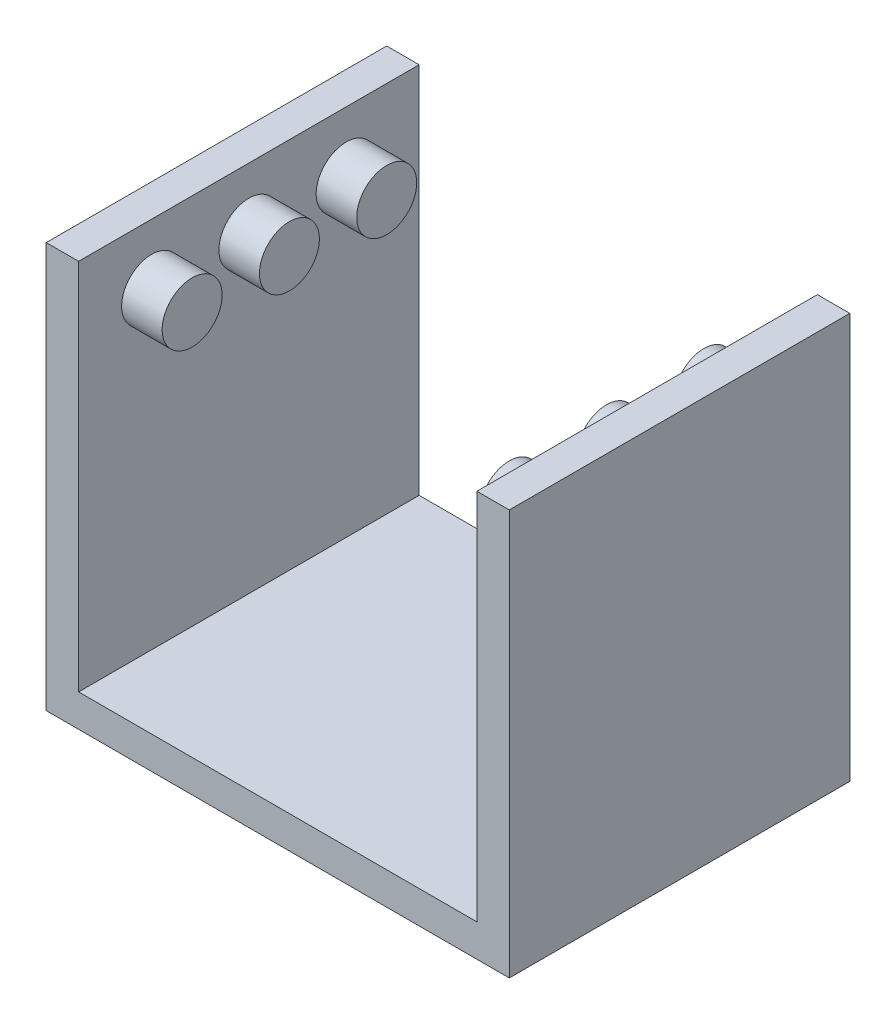
ISO-10303-21;
HEADER;
FILE_DESCRIPTION(('STEP AP214'),'2;1');
FILE_NAME('part.step','',(''),(''),'','','');
FILE_SCHEMA(('AUTOMOTIVE_DESIGN { 1 0 10303 214 1 1 1 1 }'));
ENDSEC;
DATA;
#1=APPLICATION_CONTEXT('core data for automotive mechanical design processes');
#2=APPLICATION_PROTOCOL_DEFINITION('international standard','automotive_design',2000,#1);
#3=PRODUCT_CONTEXT('',#1,'mechanical');
#4=PRODUCT('Part','Part','',(#3));
#5=PRODUCT_RELATED_PRODUCT_CATEGORY('part','',(#4));
#6=PRODUCT_DEFINITION_FORMATION('','',#4);
#7=PRODUCT_DEFINITION_CONTEXT('part definition',#1,'design');
#8=PRODUCT_DEFINITION('design','',#6,#7);
#9=PRODUCT_DEFINITION_SHAPE('','',#8);
#10=(LENGTH_UNIT() NAMED_UNIT(*) SI_UNIT(.MILLI.,.METRE.));
#11=(NAMED_UNIT(*) PLANE_ANGLE_UNIT() SI_UNIT($,.RADIAN.));
#12=(NAMED_UNIT(*) SI_UNIT($,.STERADIAN.) SOLID_ANGLE_UNIT());
#13=UNCERTAINTY_MEASURE_WITH_UNIT(LENGTH_MEASURE(1.E-05),#10,'distance_accuracy_value','');
#14=(GEOMETRIC_REPRESENTATION_CONTEXT(3) GLOBAL_UNCERTAINTY_ASSIGNED_CONTEXT((#13)) GLOBAL_UNIT_ASSIGNED_CONTEXT((#10,
#11,#12)) REPRESENTATION_CONTEXT('',''));
#15=CARTESIAN_POINT('',(0.,0.,0.));
#16=DIRECTION('',(0.,0.,1.));
#17=DIRECTION('',(1.,0.,0.));
#18=AXIS2_PLACEMENT_3D('',#15,#16,#17);
#19=CARTESIAN_POINT('',(-9.73952411496912,-24.,-4.5));
#20=DIRECTION('',(-1.,0.,0.));
#21=DIRECTION('',(0.,0.,1.));
#22=AXIS2_PLACEMENT_3D('',#19,#20,#21);
#23=CYLINDRICAL_SURFACE('',#22,1.85);
#24=CARTESIAN_POINT('',(-9.73952411496912,-24.,-4.5));
#25=DIRECTION('',(1.,0.,0.));
#26=DIRECTION('',(0.,0.,-1.));
#27=AXIS2_PLACEMENT_3D('',#24,#25,#26);
#28=CIRCLE('',#27,1.85);
#29=CARTESIAN_POINT('',(-9.73952411496912,-24.,-6.35));
#30=VERTEX_POINT('',#29);
#31=EDGE_CURVE('E49',#30,#30,#28,.T.);
#32=ORIENTED_EDGE('',*,*,#31,.F.);
#33=EDGE_LOOP('',(#32));
#34=FACE_BOUND('',#33,.T.);
#35=CARTESIAN_POINT('',(-12.2395241149691,-24.,-4.5));
#36=DIRECTION('',(1.,0.,0.));
#37=DIRECTION('',(0.,0.,-1.));
#38=AXIS2_PLACEMENT_3D('',#35,#36,#37);
#39=CIRCLE('',#38,1.85);
#40=CARTESIAN_POINT('',(-12.2395241149691,-24.,-6.35));
#41=VERTEX_POINT('',#40);
#42=EDGE_CURVE('E11',#41,#41,#39,.T.);
#43=ORIENTED_EDGE('',*,*,#42,.T.);
#44=EDGE_LOOP('',(#43));
#45=FACE_BOUND('',#44,.T.);
#46=ADVANCED_FACE('F45',(#34,#45),#23,.T.);
#47=CARTESIAN_POINT('',(-9.73952411496912,-24.,-4.5));
#48=DIRECTION('',(1.,0.,0.));
#49=DIRECTION('',(0.,0.,-1.));
#50=AXIS2_PLACEMENT_3D('',#47,#48,#49);
#51=PLANE('',#50);
#52=ORIENTED_EDGE('',*,*,#31,.T.);
#53=EDGE_LOOP('',(#52));
#54=FACE_BOUND('',#53,.T.);
#55=ADVANCED_FACE('F47',(#54),#51,.T.);
#56=CARTESIAN_POINT('',(-12.2395241149691,-24.,-4.5));
#57=DIRECTION('',(1.,0.,0.));
#58=DIRECTION('',(0.,0.,-1.));
#59=AXIS2_PLACEMENT_3D('',#56,#57,#58);
#60=PLANE('',#59);
#61=ORIENTED_EDGE('',*,*,#42,.F.);
#62=EDGE_LOOP('',(#61));
#63=FACE_BOUND('',#62,.T.);
#64=ADVANCED_FACE('F64',(#63),#60,.F.);
#65=CLOSED_SHELL('',(#46,#55,#64));
#66=MANIFOLD_SOLID_BREP('B2',#65);
#67=CARTESIAN_POINT('',(-9.73952411496912,-24.,-10.5));
#68=DIRECTION('',(-1.,0.,0.));
#69=DIRECTION('',(0.,0.,1.));
#70=AXIS2_PLACEMENT_3D('',#67,#68,#69);
#71=CYLINDRICAL_SURFACE('',#70,1.85);
#72=CARTESIAN_POINT('',(-9.73952411496912,-24.,-10.5));
#73=DIRECTION('',(1.,0.,0.));
#74=DIRECTION('',(0.,0.,-1.));
#75=AXIS2_PLACEMENT_3D('',#72,#73,#74);
#76=CIRCLE('',#75,1.85);
#77=CARTESIAN_POINT('',(-9.73952411496912,-24.,-12.35));
#78=VERTEX_POINT('',#77);
#79=EDGE_CURVE('E103',#78,#78,#76,.T.);
#80=ORIENTED_EDGE('',*,*,#79,.F.);
#81=EDGE_LOOP('',(#80));
#82=FACE_BOUND('',#81,.T.);
#83=CARTESIAN_POINT('',(-12.2395241149691,-24.,-10.5));
#84=DIRECTION('',(1.,0.,0.));
#85=DIRECTION('',(0.,0.,-1.));
#86=AXIS2_PLACEMENT_3D('',#83,#84,#85);
#87=CIRCLE('',#86,1.85);
#88=CARTESIAN_POINT('',(-12.2395241149691,-24.,-12.35));
#89=VERTEX_POINT('',#88);
#90=EDGE_CURVE('E44',#89,#89,#87,.T.);
#91=ORIENTED_EDGE('',*,*,#90,.T.);
#92=EDGE_LOOP('',(#91));
#93=FACE_BOUND('',#92,.T.);
#94=ADVANCED_FACE('F99',(#82,#93),#71,.T.);
#95=CARTESIAN_POINT('',(-9.73952411496912,-24.,-10.5));
#96=DIRECTION('',(1.,0.,0.));
#97=DIRECTION('',(0.,0.,-1.));
#98=AXIS2_PLACEMENT_3D('',#95,#96,#97);
#99=PLANE('',#98);
#100=ORIENTED_EDGE('',*,*,#79,.T.);
#101=EDGE_LOOP('',(#100));
#102=FACE_BOUND('',#101,.T.);
#103=ADVANCED_FACE('F101',(#102),#99,.T.);
#104=CARTESIAN_POINT('',(-12.2395241149691,-24.,-10.5));
#105=DIRECTION('',(1.,0.,0.));
#106=DIRECTION('',(0.,0.,-1.));
#107=AXIS2_PLACEMENT_3D('',#104,#105,#106);
#108=PLANE('',#107);
#109=ORIENTED_EDGE('',*,*,#90,.F.);
#110=EDGE_LOOP('',(#109));
#111=FACE_BOUND('',#110,.T.);
#112=ADVANCED_FACE('F118',(#111),#108,.F.);
#113=CLOSED_SHELL('',(#94,#103,#112));
#114=MANIFOLD_SOLID_BREP('B6',#113);
#115=CARTESIAN_POINT('',(-9.73952411496912,-24.,-16.5));
#116=DIRECTION('',(-1.,0.,0.));
#117=DIRECTION('',(0.,0.,1.));
#118=AXIS2_PLACEMENT_3D('',#115,#116,#117);
#119=CYLINDRICAL_SURFACE('',#118,1.85);
#120=CARTESIAN_POINT('',(-9.73952411496912,-24.,-16.5));
#121=DIRECTION('',(1.,0.,0.));
#122=DIRECTION('',(0.,0.,-1.));
#123=AXIS2_PLACEMENT_3D('',#120,#121,#122);
#124=CIRCLE('',#123,1.85);
#125=CARTESIAN_POINT('',(-9.73952411496912,-24.,-18.35));
#126=VERTEX_POINT('',#125);
#127=EDGE_CURVE('E98',#126,#126,#124,.T.);
#128=ORIENTED_EDGE('',*,*,#127,.F.);
#129=EDGE_LOOP('',(#128));
#130=FACE_BOUND('',#129,.T.);
#131=CARTESIAN_POINT('',(-12.2395241149691,-24.,-16.5));
#132=DIRECTION('',(1.,0.,0.));
#133=DIRECTION('',(0.,0.,-1.));
#134=AXIS2_PLACEMENT_3D('',#131,#132,#133);
#135=CIRCLE('',#134,1.85);
#136=CARTESIAN_POINT('',(-12.2395241149691,-24.,-18.35));
#137=VERTEX_POINT('',#136);
#138=EDGE_CURVE('E157',#137,#137,#135,.T.);
#139=ORIENTED_EDGE('',*,*,#138,.T.);
#140=EDGE_LOOP('',(#139));
#141=FACE_BOUND('',#140,.T.);
#142=ADVANCED_FACE('F154',(#130,#141),#119,.T.);
#143=CARTESIAN_POINT('',(-9.73952411496912,-24.,-16.5));
#144=DIRECTION('',(1.,0.,0.));
#145=DIRECTION('',(0.,0.,-1.));
#146=AXIS2_PLACEMENT_3D('',#143,#144,#145);
#147=PLANE('',#146);
#148=ORIENTED_EDGE('',*,*,#127,.T.);
#149=EDGE_LOOP('',(#148));
#150=FACE_BOUND('',#149,.T.);
#151=ADVANCED_FACE('F169',(#150),#147,.T.);
#152=CARTESIAN_POINT('',(-12.2395241149691,-24.,-16.5));
#153=DIRECTION('',(1.,0.,0.));
#154=DIRECTION('',(0.,0.,-1.));
#155=AXIS2_PLACEMENT_3D('',#152,#153,#154);
#156=PLANE('',#155);
#157=ORIENTED_EDGE('',*,*,#138,.F.);
#158=EDGE_LOOP('',(#157));
#159=FACE_BOUND('',#158,.T.);
#160=ADVANCED_FACE('F167',(#159),#156,.F.);
#161=CLOSED_SHELL('',(#142,#151,#160));
#162=MANIFOLD_SOLID_BREP('B39',#161);
#163=CARTESIAN_POINT('',(12.3206969324508,-43.2719705138247,-21.));
#164=DIRECTION('',(0.,1.,0.));
#165=DIRECTION('',(0.,0.,1.));
#166=AXIS2_PLACEMENT_3D('',#163,#164,#165);
#167=PLANE('',#166);
#168=DIRECTION('',(-1.,0.,0.));
#169=VECTOR('',#168,1.);
#170=CARTESIAN_POINT('',(12.3206969324508,-43.2719705138247,0.));
#171=LINE('',#170,#169);
#172=CARTESIAN_POINT('',(12.3206969324508,-43.2719705138247,0.));
#173=VERTEX_POINT('',#172);
#174=CARTESIAN_POINT('',(-12.2395241149691,-43.2719705138247,0.));
#175=VERTEX_POINT('',#174);
#176=EDGE_CURVE('E298',#173,#175,#171,.T.);
#177=ORIENTED_EDGE('',*,*,#176,.F.);
#178=DIRECTION('',(0.,0.,1.));
#179=VECTOR('',#178,1.);
#180=CARTESIAN_POINT('',(12.3206969324508,-43.2719705138247,-21.));
#181=LINE('',#180,#179);
#182=CARTESIAN_POINT('',(12.3206969324508,-43.2719705138247,-21.));
#183=VERTEX_POINT('',#182);
#184=EDGE_CURVE('E152',#183,#173,#181,.T.);
#185=ORIENTED_EDGE('',*,*,#184,.F.);
#186=DIRECTION('',(-1.,0.,0.));
#187=VECTOR('',#186,1.);
#188=CARTESIAN_POINT('',(12.3206969324508,-43.2719705138247,-21.));
#189=LINE('',#188,#187);
#190=CARTESIAN_POINT('',(-12.2395241149691,-43.2719705138247,-21.));
#191=VERTEX_POINT('',#190);
#192=EDGE_CURVE('E319',#183,#191,#189,.T.);
#193=ORIENTED_EDGE('',*,*,#192,.T.);
#194=DIRECTION('',(0.,0.,1.));
#195=VECTOR('',#194,1.);
#196=CARTESIAN_POINT('',(-12.2395241149691,-43.2719705138247,-21.));
#197=LINE('',#196,#195);
#198=EDGE_CURVE('E204',#191,#175,#197,.T.);
#199=ORIENTED_EDGE('',*,*,#198,.T.);
#200=EDGE_LOOP('',(#177,#185,#193,#199));
#201=FACE_BOUND('',#200,.T.);
#202=ADVANCED_FACE('F201',(#201),#167,.T.);
#203=CARTESIAN_POINT('',(12.3206969324508,-20.2719705138247,-21.));
#204=DIRECTION('',(-1.,0.,0.));
#205=DIRECTION('',(0.,-1.,0.));
#206=AXIS2_PLACEMENT_3D('',#203,#204,#205);
#207=PLANE('',#206);
#208=CARTESIAN_POINT('',(12.3206969324508,-24.,-16.5));
#209=DIRECTION('',(-1.,0.,0.));
#210=DIRECTION('',(0.,-1.,0.));
#211=AXIS2_PLACEMENT_3D('',#208,#209,#210);
#212=CIRCLE('',#211,1.85);
#213=CARTESIAN_POINT('',(12.3206969324508,-25.85,-16.5));
#214=VERTEX_POINT('',#213);
#215=EDGE_CURVE('E396',#214,#214,#212,.T.);
#216=ORIENTED_EDGE('',*,*,#215,.F.);
#217=EDGE_LOOP('',(#216));
#218=FACE_BOUND('',#217,.T.);
#219=CARTESIAN_POINT('',(12.3206969324508,-24.,-10.5));
#220=DIRECTION('',(-1.,0.,0.));
#221=DIRECTION('',(0.,-1.,0.));
#222=AXIS2_PLACEMENT_3D('',#219,#220,#221);
#223=CIRCLE('',#222,1.85);
#224=CARTESIAN_POINT('',(12.3206969324508,-25.85,-10.5));
#225=VERTEX_POINT('',#224);
#226=EDGE_CURVE('E400',#225,#225,#223,.T.);
#227=ORIENTED_EDGE('',*,*,#226,.F.);
#228=EDGE_LOOP('',(#227));
#229=FACE_BOUND('',#228,.T.);
#230=CARTESIAN_POINT('',(12.3206969324508,-24.,-4.5));
#231=DIRECTION('',(-1.,0.,0.));
#232=DIRECTION('',(0.,-1.,0.));
#233=AXIS2_PLACEMENT_3D('',#230,#231,#232);
#234=CIRCLE('',#233,1.85);
#235=CARTESIAN_POINT('',(12.3206969324508,-25.85,-4.5));
#236=VERTEX_POINT('',#235);
#237=EDGE_CURVE('E405',#236,#236,#234,.T.);
#238=ORIENTED_EDGE('',*,*,#237,.F.);
#239=EDGE_LOOP('',(#238));
#240=FACE_BOUND('',#239,.T.);
#241=DIRECTION('',(0.,-1.,0.));
#242=VECTOR('',#241,1.);
#243=CARTESIAN_POINT('',(12.3206969324508,-20.2719705138247,0.));
#244=LINE('',#243,#242);
#245=CARTESIAN_POINT('',(12.3206969324508,-20.2719705138247,0.));
#246=VERTEX_POINT('',#245);
#247=EDGE_CURVE('E317',#246,#173,#244,.T.);
#248=ORIENTED_EDGE('',*,*,#247,.F.);
#249=DIRECTION('',(0.,0.,1.));
#250=VECTOR('',#249,1.);
#251=CARTESIAN_POINT('',(12.3206969324508,-20.2719705138247,-21.));
#252=LINE('',#251,#250);
#253=CARTESIAN_POINT('',(12.3206969324508,-20.2719705138247,-21.));
#254=VERTEX_POINT('',#253);
#255=EDGE_CURVE('E210',#254,#246,#252,.T.);
#256=ORIENTED_EDGE('',*,*,#255,.F.);
#257=DIRECTION('',(0.,-1.,0.));
#258=VECTOR('',#257,1.);
#259=CARTESIAN_POINT('',(12.3206969324508,-20.2719705138247,-21.));
#260=LINE('',#259,#258);
#261=EDGE_CURVE('E288',#254,#183,#260,.T.);
#262=ORIENTED_EDGE('',*,*,#261,.T.);
#263=ORIENTED_EDGE('',*,*,#184,.T.);
#264=EDGE_LOOP('',(#248,#256,#262,#263));
#265=FACE_BOUND('',#264,.T.);
#266=ADVANCED_FACE('F331',(#218,#229,#240,#265),#207,.T.);
#267=CARTESIAN_POINT('',(12.3206969324508,-20.2719705138247,-21.));
#268=DIRECTION('',(0.,1.,0.));
#269=DIRECTION('',(0.,0.,1.));
#270=AXIS2_PLACEMENT_3D('',#267,#268,#269);
#271=PLANE('',#270);
#272=DIRECTION('',(-1.,0.,0.));
#273=VECTOR('',#272,1.);
#274=CARTESIAN_POINT('',(12.3206969324508,-20.2719705138247,0.));
#275=LINE('',#274,#273);
#276=CARTESIAN_POINT('',(14.3206969324508,-20.2719705138247,0.));
#277=VERTEX_POINT('',#276);
#278=EDGE_CURVE('E275',#277,#246,#275,.T.);
#279=ORIENTED_EDGE('',*,*,#278,.F.);
#280=DIRECTION('',(0.,0.,1.));
#281=VECTOR('',#280,1.);
#282=CARTESIAN_POINT('',(14.3206969324508,-20.2719705138247,-21.));
#283=LINE('',#282,#281);
#284=CARTESIAN_POINT('',(14.3206969324508,-20.2719705138247,-21.));
#285=VERTEX_POINT('',#284);
#286=EDGE_CURVE('E270',#285,#277,#283,.T.);
#287=ORIENTED_EDGE('',*,*,#286,.F.);
#288=DIRECTION('',(-1.,0.,0.));
#289=VECTOR('',#288,1.);
#290=CARTESIAN_POINT('',(12.3206969324508,-20.2719705138247,-21.));
#291=LINE('',#290,#289);
#292=EDGE_CURVE('E273',#285,#254,#291,.T.);
#293=ORIENTED_EDGE('',*,*,#292,.T.);
#294=ORIENTED_EDGE('',*,*,#255,.T.);
#295=EDGE_LOOP('',(#279,#287,#293,#294));
#296=FACE_BOUND('',#295,.T.);
#297=ADVANCED_FACE('F272',(#296),#271,.T.);
#298=CARTESIAN_POINT('',(14.3206969324508,-20.2719705138247,-21.));
#299=DIRECTION('',(1.,0.,0.));
#300=DIRECTION('',(0.,1.,0.));
#301=AXIS2_PLACEMENT_3D('',#298,#299,#300);
#302=PLANE('',#301);
#303=DIRECTION('',(0.,1.,0.));
#304=VECTOR('',#303,1.);
#305=CARTESIAN_POINT('',(14.3206969324508,-20.2719705138247,0.));
#306=LINE('',#305,#304);
#307=CARTESIAN_POINT('',(14.3206969324508,-45.2719705138247,0.));
#308=VERTEX_POINT('',#307);
#309=EDGE_CURVE('E314',#308,#277,#306,.T.);
#310=ORIENTED_EDGE('',*,*,#309,.F.);
#311=DIRECTION('',(0.,0.,1.));
#312=VECTOR('',#311,1.);
#313=CARTESIAN_POINT('',(14.3206969324508,-45.2719705138247,-21.));
#314=LINE('',#313,#312);
#315=CARTESIAN_POINT('',(14.3206969324508,-45.2719705138247,-21.));
#316=VERTEX_POINT('',#315);
#317=EDGE_CURVE('E280',#316,#308,#314,.T.);
#318=ORIENTED_EDGE('',*,*,#317,.F.);
#319=DIRECTION('',(0.,1.,0.));
#320=VECTOR('',#319,1.);
#321=CARTESIAN_POINT('',(14.3206969324508,-20.2719705138247,-21.));
#322=LINE('',#321,#320);
#323=EDGE_CURVE('E286',#316,#285,#322,.T.);
#324=ORIENTED_EDGE('',*,*,#323,.T.);
#325=ORIENTED_EDGE('',*,*,#286,.T.);
#326=EDGE_LOOP('',(#310,#318,#324,#325));
#327=FACE_BOUND('',#326,.T.);
#328=ADVANCED_FACE('F290',(#327),#302,.T.);
#329=CARTESIAN_POINT('',(14.3206969324508,-45.2719705138247,-21.));
#330=DIRECTION('',(0.,-1.,0.));
#331=DIRECTION('',(0.,0.,-1.));
#332=AXIS2_PLACEMENT_3D('',#329,#330,#331);
#333=PLANE('',#332);
#334=DIRECTION('',(1.,0.,0.));
#335=VECTOR('',#334,1.);
#336=CARTESIAN_POINT('',(14.3206969324508,-45.2719705138247,0.));
#337=LINE('',#336,#335);
#338=CARTESIAN_POINT('',(-14.2395241149691,-45.2719705138247,0.));
#339=VERTEX_POINT('',#338);
#340=EDGE_CURVE('E311',#339,#308,#337,.T.);
#341=ORIENTED_EDGE('',*,*,#340,.F.);
#342=DIRECTION('',(0.,0.,1.));
#343=VECTOR('',#342,1.);
#344=CARTESIAN_POINT('',(-14.2395241149691,-45.2719705138247,-21.));
#345=LINE('',#344,#343);
#346=CARTESIAN_POINT('',(-14.2395241149691,-45.2719705138247,-21.));
#347=VERTEX_POINT('',#346);
#348=EDGE_CURVE('E323',#347,#339,#345,.T.);
#349=ORIENTED_EDGE('',*,*,#348,.F.);
#350=DIRECTION('',(1.,0.,0.));
#351=VECTOR('',#350,1.);
#352=CARTESIAN_POINT('',(14.3206969324508,-45.2719705138247,-21.));
#353=LINE('',#352,#351);
#354=EDGE_CURVE('E291',#347,#316,#353,.T.);
#355=ORIENTED_EDGE('',*,*,#354,.T.);
#356=ORIENTED_EDGE('',*,*,#317,.T.);
#357=EDGE_LOOP('',(#341,#349,#355,#356));
#358=FACE_BOUND('',#357,.T.);
#359=ADVANCED_FACE('F347',(#358),#333,.T.);
#360=CARTESIAN_POINT('',(-14.2395241149691,-45.2719705138247,-21.));
#361=DIRECTION('',(-1.,0.,0.));
#362=DIRECTION('',(0.,-1.,0.));
#363=AXIS2_PLACEMENT_3D('',#360,#361,#362);
#364=PLANE('',#363);
#365=DIRECTION('',(0.,-1.,0.));
#366=VECTOR('',#365,1.);
#367=CARTESIAN_POINT('',(-14.2395241149691,-45.2719705138247,0.));
#368=LINE('',#367,#366);
#369=CARTESIAN_POINT('',(-14.2395241149691,-20.2719705138247,0.));
#370=VERTEX_POINT('',#369);
#371=EDGE_CURVE('E308',#370,#339,#368,.T.);
#372=ORIENTED_EDGE('',*,*,#371,.F.);
#373=DIRECTION('',(0.,0.,1.));
#374=VECTOR('',#373,1.);
#375=CARTESIAN_POINT('',(-14.2395241149691,-20.2719705138247,-21.));
#376=LINE('',#375,#374);
#377=CARTESIAN_POINT('',(-14.2395241149691,-20.2719705138247,-21.));
#378=VERTEX_POINT('',#377);
#379=EDGE_CURVE('E325',#378,#370,#376,.T.);
#380=ORIENTED_EDGE('',*,*,#379,.F.);
#381=DIRECTION('',(0.,-1.,0.));
#382=VECTOR('',#381,1.);
#383=CARTESIAN_POINT('',(-14.2395241149691,-45.2719705138247,-21.));
#384=LINE('',#383,#382);
#385=EDGE_CURVE('E293',#378,#347,#384,.T.);
#386=ORIENTED_EDGE('',*,*,#385,.T.);
#387=ORIENTED_EDGE('',*,*,#348,.T.);
#388=EDGE_LOOP('',(#372,#380,#386,#387));
#389=FACE_BOUND('',#388,.T.);
#390=ADVANCED_FACE('F350',(#389),#364,.T.);
#391=CARTESIAN_POINT('',(-14.2395241149691,-20.2719705138247,-21.));
#392=DIRECTION('',(0.,1.,0.));
#393=DIRECTION('',(0.,0.,1.));
#394=AXIS2_PLACEMENT_3D('',#391,#392,#393);
#395=PLANE('',#394);
#396=DIRECTION('',(-1.,0.,0.));
#397=VECTOR('',#396,1.);
#398=CARTESIAN_POINT('',(-14.2395241149691,-20.2719705138247,0.));
#399=LINE('',#398,#397);
#400=CARTESIAN_POINT('',(-12.2395241149691,-20.2719705138247,0.));
#401=VERTEX_POINT('',#400);
#402=EDGE_CURVE('E305',#401,#370,#399,.T.);
#403=ORIENTED_EDGE('',*,*,#402,.F.);
#404=DIRECTION('',(0.,0.,1.));
#405=VECTOR('',#404,1.);
#406=CARTESIAN_POINT('',(-12.2395241149691,-20.2719705138247,-21.));
#407=LINE('',#406,#405);
#408=CARTESIAN_POINT('',(-12.2395241149691,-20.2719705138247,-21.));
#409=VERTEX_POINT('',#408);
#410=EDGE_CURVE('E326',#409,#401,#407,.T.);
#411=ORIENTED_EDGE('',*,*,#410,.F.);
#412=DIRECTION('',(-1.,0.,0.));
#413=VECTOR('',#412,1.);
#414=CARTESIAN_POINT('',(-14.2395241149691,-20.2719705138247,-21.));
#415=LINE('',#414,#413);
#416=EDGE_CURVE('E414',#409,#378,#415,.T.);
#417=ORIENTED_EDGE('',*,*,#416,.T.);
#418=ORIENTED_EDGE('',*,*,#379,.T.);
#419=EDGE_LOOP('',(#403,#411,#417,#418));
#420=FACE_BOUND('',#419,.T.);
#421=ADVANCED_FACE('F354',(#420),#395,.T.);
#422=CARTESIAN_POINT('',(-12.2395241149691,-43.2719705138247,-21.));
#423=DIRECTION('',(1.,0.,0.));
#424=DIRECTION('',(0.,0.,-1.));
#425=AXIS2_PLACEMENT_3D('',#422,#423,#424);
#426=PLANE('',#425);
#427=DIRECTION('',(0.,1.,0.));
#428=VECTOR('',#427,1.);
#429=CARTESIAN_POINT('',(-12.2395241149691,-43.2719705138247,0.));
#430=LINE('',#429,#428);
#431=EDGE_CURVE('E301',#175,#401,#430,.T.);
#432=ORIENTED_EDGE('',*,*,#431,.F.);
#433=ORIENTED_EDGE('',*,*,#198,.F.);
#434=DIRECTION('',(0.,1.,0.));
#435=VECTOR('',#434,1.);
#436=CARTESIAN_POINT('',(-12.2395241149691,-43.2719705138247,-21.));
#437=LINE('',#436,#435);
#438=EDGE_CURVE('E412',#191,#409,#437,.T.);
#439=ORIENTED_EDGE('',*,*,#438,.T.);
#440=ORIENTED_EDGE('',*,*,#410,.T.);
#441=EDGE_LOOP('',(#432,#433,#439,#440));
#442=FACE_BOUND('',#441,.T.);
#443=ADVANCED_FACE('F328',(#442),#426,.T.);
#444=CARTESIAN_POINT('',(0.,0.,-21.));
#445=DIRECTION('',(0.,0.,-1.));
#446=DIRECTION('',(-1.,0.,0.));
#447=AXIS2_PLACEMENT_3D('',#444,#445,#446);
#448=PLANE('',#447);
#449=ORIENTED_EDGE('',*,*,#192,.F.);
#450=ORIENTED_EDGE('',*,*,#261,.F.);
#451=ORIENTED_EDGE('',*,*,#292,.F.);
#452=ORIENTED_EDGE('',*,*,#323,.F.);
#453=ORIENTED_EDGE('',*,*,#354,.F.);
#454=ORIENTED_EDGE('',*,*,#385,.F.);
#455=ORIENTED_EDGE('',*,*,#416,.F.);
#456=ORIENTED_EDGE('',*,*,#438,.F.);
#457=EDGE_LOOP('',(#449,#450,#451,#452,#453,#454,#455,#456));
#458=FACE_BOUND('',#457,.T.);
#459=ADVANCED_FACE('F284',(#458),#448,.T.);
#460=CARTESIAN_POINT('',(0.,0.,0.));
#461=DIRECTION('',(0.,0.,-1.));
#462=DIRECTION('',(-1.,0.,0.));
#463=AXIS2_PLACEMENT_3D('',#460,#461,#462);
#464=PLANE('',#463);
#465=ORIENTED_EDGE('',*,*,#176,.T.);
#466=ORIENTED_EDGE('',*,*,#431,.T.);
#467=ORIENTED_EDGE('',*,*,#402,.T.);
#468=ORIENTED_EDGE('',*,*,#371,.T.);
#469=ORIENTED_EDGE('',*,*,#340,.T.);
#470=ORIENTED_EDGE('',*,*,#309,.T.);
#471=ORIENTED_EDGE('',*,*,#278,.T.);
#472=ORIENTED_EDGE('',*,*,#247,.T.);
#473=EDGE_LOOP('',(#465,#466,#467,#468,#469,#470,#471,#472));
#474=FACE_BOUND('',#473,.T.);
#475=ADVANCED_FACE('F330',(#474),#464,.F.);
#476=CARTESIAN_POINT('',(9.82069693245084,-24.,-4.5));
#477=DIRECTION('',(1.,0.,0.));
#478=DIRECTION('',(0.,1.,0.));
#479=AXIS2_PLACEMENT_3D('',#476,#477,#478);
#480=CYLINDRICAL_SURFACE('',#479,1.85);
#481=CARTESIAN_POINT('',(9.82069693245084,-24.,-4.5));
#482=DIRECTION('',(-1.,0.,0.));
#483=DIRECTION('',(0.,-1.,0.));
#484=AXIS2_PLACEMENT_3D('',#481,#482,#483);
#485=CIRCLE('',#484,1.85);
#486=CARTESIAN_POINT('',(9.82069693245084,-25.85,-4.5));
#487=VERTEX_POINT('',#486);
#488=EDGE_CURVE('E302',#487,#487,#485,.T.);
#489=ORIENTED_EDGE('',*,*,#488,.F.);
#490=EDGE_LOOP('',(#489));
#491=FACE_BOUND('',#490,.T.);
#492=ORIENTED_EDGE('',*,*,#237,.T.);
#493=EDGE_LOOP('',(#492));
#494=FACE_BOUND('',#493,.T.);
#495=ADVANCED_FACE('F365',(#491,#494),#480,.T.);
#496=CARTESIAN_POINT('',(9.82069693245084,-24.,-4.5));
#497=DIRECTION('',(-1.,0.,0.));
#498=DIRECTION('',(0.,-1.,0.));
#499=AXIS2_PLACEMENT_3D('',#496,#497,#498);
#500=PLANE('',#499);
#501=ORIENTED_EDGE('',*,*,#488,.T.);
#502=EDGE_LOOP('',(#501));
#503=FACE_BOUND('',#502,.T.);
#504=ADVANCED_FACE('F369',(#503),#500,.T.);
#505=CARTESIAN_POINT('',(9.82069693245084,-24.,-10.5));
#506=DIRECTION('',(1.,0.,0.));
#507=DIRECTION('',(0.,1.,0.));
#508=AXIS2_PLACEMENT_3D('',#505,#506,#507);
#509=CYLINDRICAL_SURFACE('',#508,1.85);
#510=CARTESIAN_POINT('',(9.82069693245084,-24.,-10.5));
#511=DIRECTION('',(-1.,0.,0.));
#512=DIRECTION('',(0.,-1.,0.));
#513=AXIS2_PLACEMENT_3D('',#510,#511,#512);
#514=CIRCLE('',#513,1.85);
#515=CARTESIAN_POINT('',(9.82069693245084,-25.85,-10.5));
#516=VERTEX_POINT('',#515);
#517=EDGE_CURVE('E397',#516,#516,#514,.T.);
#518=ORIENTED_EDGE('',*,*,#517,.F.);
#519=EDGE_LOOP('',(#518));
#520=FACE_BOUND('',#519,.T.);
#521=ORIENTED_EDGE('',*,*,#226,.T.);
#522=EDGE_LOOP('',(#521));
#523=FACE_BOUND('',#522,.T.);
#524=ADVANCED_FACE('F373',(#520,#523),#509,.T.);
#525=CARTESIAN_POINT('',(9.82069693245084,-24.,-10.5));
#526=DIRECTION('',(-1.,0.,0.));
#527=DIRECTION('',(0.,-1.,0.));
#528=AXIS2_PLACEMENT_3D('',#525,#526,#527);
#529=PLANE('',#528);
#530=ORIENTED_EDGE('',*,*,#517,.T.);
#531=EDGE_LOOP('',(#530));
#532=FACE_BOUND('',#531,.T.);
#533=ADVANCED_FACE('F375',(#532),#529,.T.);
#534=CARTESIAN_POINT('',(9.82069693245084,-24.,-16.5));
#535=DIRECTION('',(1.,0.,0.));
#536=DIRECTION('',(0.,1.,0.));
#537=AXIS2_PLACEMENT_3D('',#534,#535,#536);
#538=CYLINDRICAL_SURFACE('',#537,1.85);
#539=CARTESIAN_POINT('',(9.82069693245084,-24.,-16.5));
#540=DIRECTION('',(-1.,0.,0.));
#541=DIRECTION('',(0.,-1.,0.));
#542=AXIS2_PLACEMENT_3D('',#539,#540,#541);
#543=CIRCLE('',#542,1.85);
#544=CARTESIAN_POINT('',(9.82069693245084,-25.85,-16.5));
#545=VERTEX_POINT('',#544);
#546=EDGE_CURVE('E394',#545,#545,#543,.T.);
#547=ORIENTED_EDGE('',*,*,#546,.F.);
#548=EDGE_LOOP('',(#547));
#549=FACE_BOUND('',#548,.T.);
#550=ORIENTED_EDGE('',*,*,#215,.T.);
#551=EDGE_LOOP('',(#550));
#552=FACE_BOUND('',#551,.T.);
#553=ADVANCED_FACE('F378',(#549,#552),#538,.T.);
#554=CARTESIAN_POINT('',(9.82069693245084,-24.,-16.5));
#555=DIRECTION('',(-1.,0.,0.));
#556=DIRECTION('',(0.,-1.,0.));
#557=AXIS2_PLACEMENT_3D('',#554,#555,#556);
#558=PLANE('',#557);
#559=ORIENTED_EDGE('',*,*,#546,.T.);
#560=EDGE_LOOP('',(#559));
#561=FACE_BOUND('',#560,.T.);
#562=ADVANCED_FACE('F383',(#561),#558,.T.);
#563=CLOSED_SHELL('',(#202,#266,#297,#328,#359,#390,#421,#443,#459,#475,#495,#504,#524,#533,
#553,#562));
#564=MANIFOLD_SOLID_BREP('B93',#563);
#565=ADVANCED_BREP_SHAPE_REPRESENTATION('',(#18,#66,#114,#162,#564),#14);
#566=SHAPE_DEFINITION_REPRESENTATION(#9,#565);
ENDSEC;
END-ISO-10303-21;
